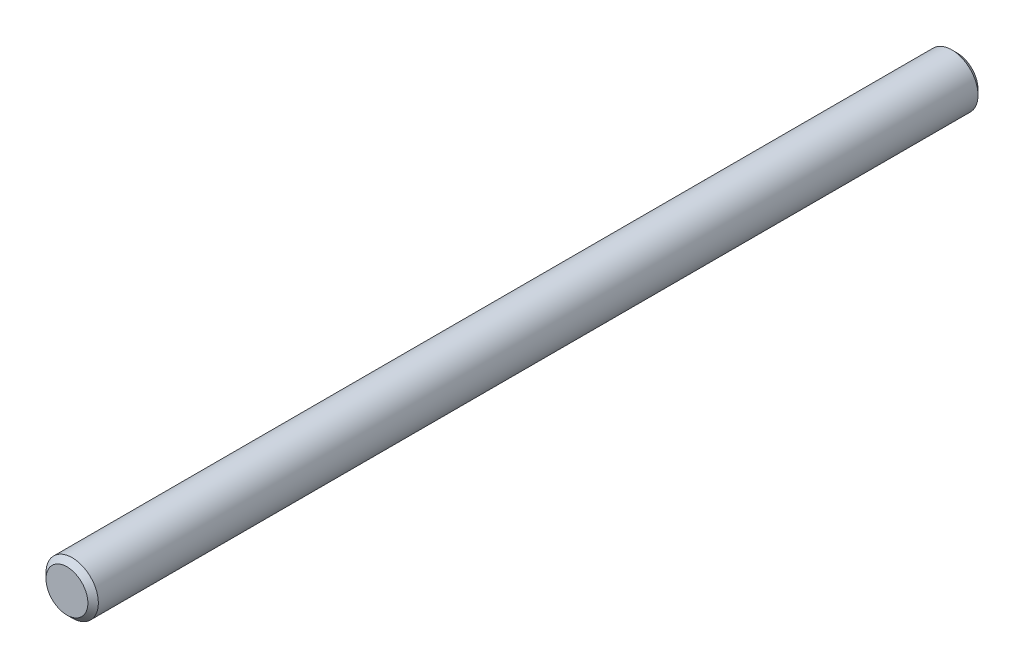
ISO-10303-21;
HEADER;
FILE_DESCRIPTION(('STEP AP214'),'2;1');
FILE_NAME('part.step','',(''),(''),'','','');
FILE_SCHEMA(('AUTOMOTIVE_DESIGN { 1 0 10303 214 1 1 1 1 }'));
ENDSEC;
DATA;
#1=APPLICATION_CONTEXT('core data for automotive mechanical design processes');
#2=APPLICATION_PROTOCOL_DEFINITION('international standard','automotive_design',2000,#1);
#3=PRODUCT_CONTEXT('',#1,'mechanical');
#4=PRODUCT('Part','Part','',(#3));
#5=PRODUCT_RELATED_PRODUCT_CATEGORY('part','',(#4));
#6=PRODUCT_DEFINITION_FORMATION('','',#4);
#7=PRODUCT_DEFINITION_CONTEXT('part definition',#1,'design');
#8=PRODUCT_DEFINITION('design','',#6,#7);
#9=PRODUCT_DEFINITION_SHAPE('','',#8);
#10=(LENGTH_UNIT() NAMED_UNIT(*) SI_UNIT(.MILLI.,.METRE.));
#11=(NAMED_UNIT(*) PLANE_ANGLE_UNIT() SI_UNIT($,.RADIAN.));
#12=(NAMED_UNIT(*) SI_UNIT($,.STERADIAN.) SOLID_ANGLE_UNIT());
#13=UNCERTAINTY_MEASURE_WITH_UNIT(LENGTH_MEASURE(1.E-05),#10,'distance_accuracy_value','');
#14=(GEOMETRIC_REPRESENTATION_CONTEXT(3) GLOBAL_UNCERTAINTY_ASSIGNED_CONTEXT((#13)) GLOBAL_UNIT_ASSIGNED_CONTEXT((#10,
#11,#12)) REPRESENTATION_CONTEXT('',''));
#15=CARTESIAN_POINT('',(0.,0.,0.));
#16=DIRECTION('',(0.,0.,1.));
#17=DIRECTION('',(1.,0.,0.));
#18=AXIS2_PLACEMENT_3D('',#15,#16,#17);
#19=CARTESIAN_POINT('',(0.,0.,0.));
#20=DIRECTION('',(0.,0.,-1.));
#21=DIRECTION('',(-1.,0.,0.));
#22=AXIS2_PLACEMENT_3D('',#19,#20,#21);
#23=PLANE('',#22);
#24=CARTESIAN_POINT('',(0.,0.,0.));
#25=DIRECTION('',(0.,0.,-1.));
#26=DIRECTION('',(-1.,0.,0.));
#27=AXIS2_PLACEMENT_3D('',#24,#25,#26);
#28=CIRCLE('',#27,0.400000000000001);
#29=CARTESIAN_POINT('',(-0.400000000000001,0.,0.));
#30=VERTEX_POINT('',#29);
#31=EDGE_CURVE('E10',#30,#30,#28,.F.);
#32=ORIENTED_EDGE('',*,*,#31,.T.);
#33=EDGE_LOOP('',(#32));
#34=FACE_BOUND('',#33,.T.);
#35=ADVANCED_FACE('F31',(#34),#23,.F.);
#36=CARTESIAN_POINT('',(0.,0.,5.65420560747663));
#37=DIRECTION('',(0.,0.,1.));
#38=DIRECTION('',(1.,0.,0.));
#39=AXIS2_PLACEMENT_3D('',#36,#37,#38);
#40=CYLINDRICAL_SURFACE('',#39,0.5);
#41=CARTESIAN_POINT('',(0.,0.,-16.9));
#42=DIRECTION('',(0.,0.,1.));
#43=DIRECTION('',(1.,0.,0.));
#44=AXIS2_PLACEMENT_3D('',#41,#42,#43);
#45=CIRCLE('',#44,0.5);
#46=CARTESIAN_POINT('',(0.5,0.,-16.9));
#47=VERTEX_POINT('',#46);
#48=EDGE_CURVE('E42',#47,#47,#45,.T.);
#49=ORIENTED_EDGE('',*,*,#48,.T.);
#50=EDGE_LOOP('',(#49));
#51=FACE_BOUND('',#50,.T.);
#52=CARTESIAN_POINT('',(0.,0.,-0.1));
#53=DIRECTION('',(0.,0.,-1.));
#54=DIRECTION('',(-1.,0.,0.));
#55=AXIS2_PLACEMENT_3D('',#52,#53,#54);
#56=CIRCLE('',#55,0.5);
#57=CARTESIAN_POINT('',(-0.5,0.,-0.1));
#58=VERTEX_POINT('',#57);
#59=EDGE_CURVE('E46',#58,#58,#56,.T.);
#60=ORIENTED_EDGE('',*,*,#59,.T.);
#61=EDGE_LOOP('',(#60));
#62=FACE_BOUND('',#61,.T.);
#63=ADVANCED_FACE('F52',(#51,#62),#40,.T.);
#64=CARTESIAN_POINT('',(0.,0.,-17.));
#65=DIRECTION('',(0.,0.,1.));
#66=DIRECTION('',(1.,0.,0.));
#67=AXIS2_PLACEMENT_3D('',#64,#65,#66);
#68=PLANE('',#67);
#69=CARTESIAN_POINT('',(0.,0.,-17.));
#70=DIRECTION('',(0.,0.,1.));
#71=DIRECTION('',(1.,0.,0.));
#72=AXIS2_PLACEMENT_3D('',#69,#70,#71);
#73=CIRCLE('',#72,0.399999999999999);
#74=CARTESIAN_POINT('',(0.399999999999999,0.,-17.));
#75=VERTEX_POINT('',#74);
#76=EDGE_CURVE('E38',#75,#75,#73,.F.);
#77=ORIENTED_EDGE('',*,*,#76,.T.);
#78=EDGE_LOOP('',(#77));
#79=FACE_BOUND('',#78,.T.);
#80=ADVANCED_FACE('F60',(#79),#68,.F.);
#81=CARTESIAN_POINT('',(0.,0.,-16.9));
#82=DIRECTION('',(0.,0.,1.));
#83=DIRECTION('',(1.,0.,0.));
#84=AXIS2_PLACEMENT_3D('',#81,#82,#83);
#85=CONICAL_SURFACE('',#84,0.5,0.785398163397455);
#86=ORIENTED_EDGE('',*,*,#76,.F.);
#87=EDGE_LOOP('',(#86));
#88=FACE_BOUND('',#87,.T.);
#89=ORIENTED_EDGE('',*,*,#48,.F.);
#90=EDGE_LOOP('',(#89));
#91=FACE_BOUND('',#90,.T.);
#92=ADVANCED_FACE('F56',(#88,#91),#85,.T.);
#93=CARTESIAN_POINT('',(0.,0.,0.));
#94=DIRECTION('',(0.,0.,-1.));
#95=DIRECTION('',(-1.,0.,0.));
#96=AXIS2_PLACEMENT_3D('',#93,#94,#95);
#97=CONICAL_SURFACE('',#96,0.400000000000001,0.785398163397442);
#98=ORIENTED_EDGE('',*,*,#59,.F.);
#99=EDGE_LOOP('',(#98));
#100=FACE_BOUND('',#99,.T.);
#101=ORIENTED_EDGE('',*,*,#31,.F.);
#102=EDGE_LOOP('',(#101));
#103=FACE_BOUND('',#102,.T.);
#104=ADVANCED_FACE('F33',(#100,#103),#97,.T.);
#105=CLOSED_SHELL('',(#35,#63,#80,#92,#104));
#106=MANIFOLD_SOLID_BREP('B2',#105);
#107=ADVANCED_BREP_SHAPE_REPRESENTATION('',(#18,#106),#14);
#108=SHAPE_DEFINITION_REPRESENTATION(#9,#107);
ENDSEC;
END-ISO-10303-21;
